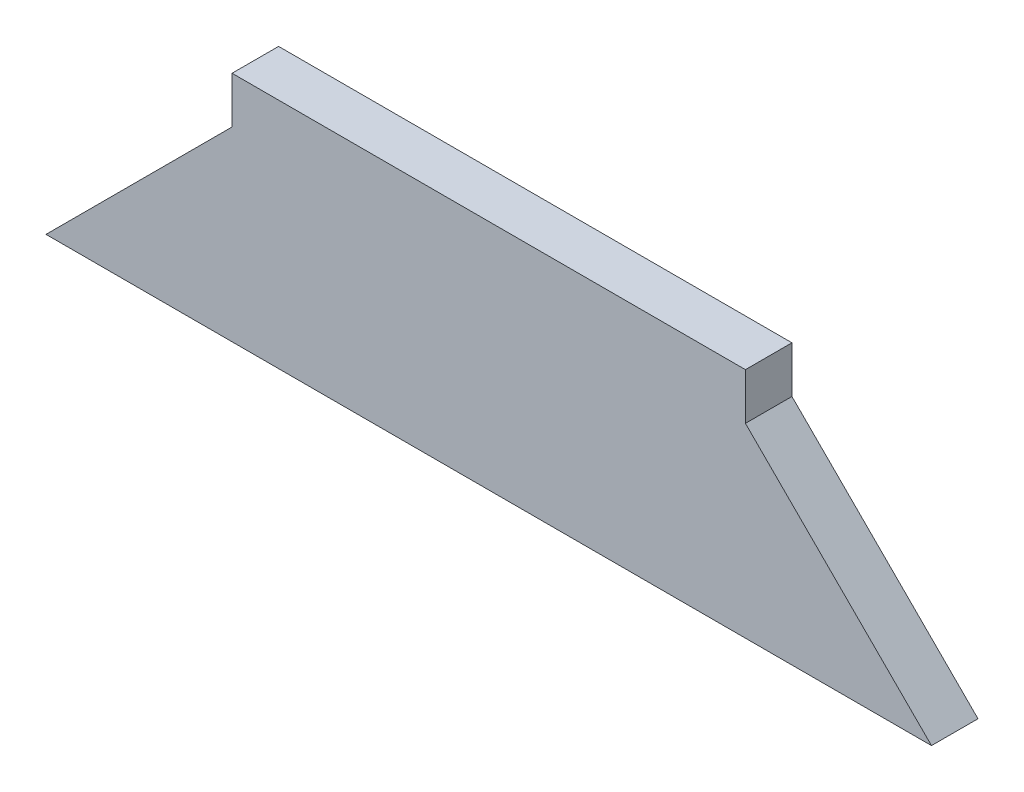
ISO-10303-21;
HEADER;
FILE_DESCRIPTION(('STEP AP214'),'2;1');
FILE_NAME('part.step','',(''),(''),'','','');
FILE_SCHEMA(('AUTOMOTIVE_DESIGN { 1 0 10303 214 1 1 1 1 }'));
ENDSEC;
DATA;
#1=APPLICATION_CONTEXT('core data for automotive mechanical design processes');
#2=APPLICATION_PROTOCOL_DEFINITION('international standard','automotive_design',2000,#1);
#3=PRODUCT_CONTEXT('',#1,'mechanical');
#4=PRODUCT('Part','Part','',(#3));
#5=PRODUCT_RELATED_PRODUCT_CATEGORY('part','',(#4));
#6=PRODUCT_DEFINITION_FORMATION('','',#4);
#7=PRODUCT_DEFINITION_CONTEXT('part definition',#1,'design');
#8=PRODUCT_DEFINITION('design','',#6,#7);
#9=PRODUCT_DEFINITION_SHAPE('','',#8);
#10=(LENGTH_UNIT() NAMED_UNIT(*) SI_UNIT(.MILLI.,.METRE.));
#11=(NAMED_UNIT(*) PLANE_ANGLE_UNIT() SI_UNIT($,.RADIAN.));
#12=(NAMED_UNIT(*) SI_UNIT($,.STERADIAN.) SOLID_ANGLE_UNIT());
#13=UNCERTAINTY_MEASURE_WITH_UNIT(LENGTH_MEASURE(1.E-05),#10,'distance_accuracy_value','');
#14=(GEOMETRIC_REPRESENTATION_CONTEXT(3) GLOBAL_UNCERTAINTY_ASSIGNED_CONTEXT((#13)) GLOBAL_UNIT_ASSIGNED_CONTEXT((#10,
#11,#12)) REPRESENTATION_CONTEXT('',''));
#15=CARTESIAN_POINT('',(0.,0.,0.));
#16=DIRECTION('',(0.,0.,1.));
#17=DIRECTION('',(1.,0.,0.));
#18=AXIS2_PLACEMENT_3D('',#15,#16,#17);
#19=CARTESIAN_POINT('',(16.5550000000012,7.00000000000001,3.));
#20=DIRECTION('',(-1.,0.,0.));
#21=DIRECTION('',(0.,-1.,0.));
#22=AXIS2_PLACEMENT_3D('',#19,#20,#21);
#23=PLANE('',#22);
#24=DIRECTION('',(0.,1.,0.));
#25=VECTOR('',#24,1.);
#26=CARTESIAN_POINT('',(16.5550000000012,7.00000000000001,0.));
#27=LINE('',#26,#25);
#28=CARTESIAN_POINT('',(16.5550000000012,7.00000000000001,0.));
#29=VERTEX_POINT('',#28);
#30=CARTESIAN_POINT('',(16.5550000000012,10.,0.));
#31=VERTEX_POINT('',#30);
#32=EDGE_CURVE('E116',#29,#31,#27,.T.);
#33=ORIENTED_EDGE('',*,*,#32,.T.);
#34=DIRECTION('',(0.,0.,-1.));
#35=VECTOR('',#34,1.);
#36=CARTESIAN_POINT('',(16.5550000000012,10.,3.));
#37=LINE('',#36,#35);
#38=CARTESIAN_POINT('',(16.5550000000012,10.,3.));
#39=VERTEX_POINT('',#38);
#40=EDGE_CURVE('E11',#39,#31,#37,.T.);
#41=ORIENTED_EDGE('',*,*,#40,.F.);
#42=DIRECTION('',(0.,1.,0.));
#43=VECTOR('',#42,1.);
#44=CARTESIAN_POINT('',(16.5550000000012,7.00000000000001,3.));
#45=LINE('',#44,#43);
#46=CARTESIAN_POINT('',(16.5550000000012,7.00000000000001,3.));
#47=VERTEX_POINT('',#46);
#48=EDGE_CURVE('E126',#47,#39,#45,.T.);
#49=ORIENTED_EDGE('',*,*,#48,.F.);
#50=DIRECTION('',(0.,0.,-1.));
#51=VECTOR('',#50,1.);
#52=CARTESIAN_POINT('',(16.5550000000012,7.00000000000001,3.));
#53=LINE('',#52,#51);
#54=EDGE_CURVE('E112',#47,#29,#53,.T.);
#55=ORIENTED_EDGE('',*,*,#54,.T.);
#56=EDGE_LOOP('',(#33,#41,#49,#55));
#57=FACE_BOUND('',#56,.T.);
#58=ADVANCED_FACE('F32',(#57),#23,.F.);
#59=CARTESIAN_POINT('',(-16.5549999999988,10.,3.));
#60=DIRECTION('',(0.,-1.,0.));
#61=DIRECTION('',(0.,0.,-1.));
#62=AXIS2_PLACEMENT_3D('',#59,#60,#61);
#63=PLANE('',#62);
#64=DIRECTION('',(-1.,0.,0.));
#65=VECTOR('',#64,1.);
#66=CARTESIAN_POINT('',(-16.5549999999988,10.,0.));
#67=LINE('',#66,#65);
#68=CARTESIAN_POINT('',(-16.5549999999988,10.,0.));
#69=VERTEX_POINT('',#68);
#70=EDGE_CURVE('E119',#31,#69,#67,.T.);
#71=ORIENTED_EDGE('',*,*,#70,.T.);
#72=DIRECTION('',(0.,0.,-1.));
#73=VECTOR('',#72,1.);
#74=CARTESIAN_POINT('',(-16.5549999999988,10.,3.));
#75=LINE('',#74,#73);
#76=CARTESIAN_POINT('',(-16.5549999999988,10.,3.));
#77=VERTEX_POINT('',#76);
#78=EDGE_CURVE('E40',#77,#69,#75,.T.);
#79=ORIENTED_EDGE('',*,*,#78,.F.);
#80=DIRECTION('',(-1.,0.,0.));
#81=VECTOR('',#80,1.);
#82=CARTESIAN_POINT('',(-16.5549999999988,10.,3.));
#83=LINE('',#82,#81);
#84=EDGE_CURVE('E85',#39,#77,#83,.T.);
#85=ORIENTED_EDGE('',*,*,#84,.F.);
#86=ORIENTED_EDGE('',*,*,#40,.T.);
#87=EDGE_LOOP('',(#71,#79,#85,#86));
#88=FACE_BOUND('',#87,.T.);
#89=ADVANCED_FACE('F150',(#88),#63,.F.);
#90=CARTESIAN_POINT('',(-16.5549999999988,7.00000000000117,3.));
#91=DIRECTION('',(1.,0.,0.));
#92=DIRECTION('',(0.,0.,-1.));
#93=AXIS2_PLACEMENT_3D('',#90,#91,#92);
#94=PLANE('',#93);
#95=DIRECTION('',(0.,-1.,0.));
#96=VECTOR('',#95,1.);
#97=CARTESIAN_POINT('',(-16.5549999999988,7.00000000000117,0.));
#98=LINE('',#97,#96);
#99=CARTESIAN_POINT('',(-16.5549999999988,7.00000000000117,0.));
#100=VERTEX_POINT('',#99);
#101=EDGE_CURVE('E121',#69,#100,#98,.T.);
#102=ORIENTED_EDGE('',*,*,#101,.T.);
#103=DIRECTION('',(0.,0.,-1.));
#104=VECTOR('',#103,1.);
#105=CARTESIAN_POINT('',(-16.5549999999988,7.00000000000117,3.));
#106=LINE('',#105,#104);
#107=CARTESIAN_POINT('',(-16.5549999999988,7.00000000000117,3.));
#108=VERTEX_POINT('',#107);
#109=EDGE_CURVE('E107',#108,#100,#106,.T.);
#110=ORIENTED_EDGE('',*,*,#109,.F.);
#111=DIRECTION('',(0.,-1.,0.));
#112=VECTOR('',#111,1.);
#113=CARTESIAN_POINT('',(-16.5549999999988,7.00000000000117,3.));
#114=LINE('',#113,#112);
#115=EDGE_CURVE('E98',#77,#108,#114,.T.);
#116=ORIENTED_EDGE('',*,*,#115,.F.);
#117=ORIENTED_EDGE('',*,*,#78,.T.);
#118=EDGE_LOOP('',(#102,#110,#116,#117));
#119=FACE_BOUND('',#118,.T.);
#120=ADVANCED_FACE('F132',(#119),#94,.F.);
#121=CARTESIAN_POINT('',(-16.5549999999988,7.00000000000117,3.));
#122=DIRECTION('',(0.707106781186547,-0.707106781186547,0.));
#123=DIRECTION('',(0.707106781186548,0.707106781186548,0.));
#124=AXIS2_PLACEMENT_3D('',#121,#122,#123);
#125=PLANE('',#124);
#126=DIRECTION('',(-0.707106781186548,-0.707106781186548,0.));
#127=VECTOR('',#126,1.);
#128=CARTESIAN_POINT('',(-16.5549999999988,7.00000000000117,0.));
#129=LINE('',#128,#127);
#130=CARTESIAN_POINT('',(-28.555,-4.99999999999999,0.));
#131=VERTEX_POINT('',#130);
#132=EDGE_CURVE('E106',#100,#131,#129,.T.);
#133=ORIENTED_EDGE('',*,*,#132,.T.);
#134=DIRECTION('',(0.,0.,-1.));
#135=VECTOR('',#134,1.);
#136=CARTESIAN_POINT('',(-28.555,-4.99999999999999,3.));
#137=LINE('',#136,#135);
#138=CARTESIAN_POINT('',(-28.555,-4.99999999999999,3.));
#139=VERTEX_POINT('',#138);
#140=EDGE_CURVE('E103',#139,#131,#137,.T.);
#141=ORIENTED_EDGE('',*,*,#140,.F.);
#142=DIRECTION('',(-0.707106781186548,-0.707106781186548,0.));
#143=VECTOR('',#142,1.);
#144=CARTESIAN_POINT('',(-16.5549999999988,7.00000000000117,3.));
#145=LINE('',#144,#143);
#146=EDGE_CURVE('E92',#108,#139,#145,.T.);
#147=ORIENTED_EDGE('',*,*,#146,.F.);
#148=ORIENTED_EDGE('',*,*,#109,.T.);
#149=EDGE_LOOP('',(#133,#141,#147,#148));
#150=FACE_BOUND('',#149,.T.);
#151=ADVANCED_FACE('F104',(#150),#125,.F.);
#152=CARTESIAN_POINT('',(-28.555,-4.99999999999999,3.));
#153=DIRECTION('',(0.,1.,0.));
#154=DIRECTION('',(0.,0.,1.));
#155=AXIS2_PLACEMENT_3D('',#152,#153,#154);
#156=PLANE('',#155);
#157=DIRECTION('',(1.,0.,0.));
#158=VECTOR('',#157,1.);
#159=CARTESIAN_POINT('',(-28.555,-4.99999999999999,0.));
#160=LINE('',#159,#158);
#161=CARTESIAN_POINT('',(28.5550000000012,-4.99999999999999,0.));
#162=VERTEX_POINT('',#161);
#163=EDGE_CURVE('E71',#131,#162,#160,.T.);
#164=ORIENTED_EDGE('',*,*,#163,.T.);
#165=DIRECTION('',(0.,0.,-1.));
#166=VECTOR('',#165,1.);
#167=CARTESIAN_POINT('',(28.5550000000012,-4.99999999999999,3.));
#168=LINE('',#167,#166);
#169=CARTESIAN_POINT('',(28.5550000000012,-4.99999999999999,3.));
#170=VERTEX_POINT('',#169);
#171=EDGE_CURVE('E108',#170,#162,#168,.T.);
#172=ORIENTED_EDGE('',*,*,#171,.F.);
#173=DIRECTION('',(1.,0.,0.));
#174=VECTOR('',#173,1.);
#175=CARTESIAN_POINT('',(-28.555,-4.99999999999999,3.));
#176=LINE('',#175,#174);
#177=EDGE_CURVE('E96',#139,#170,#176,.T.);
#178=ORIENTED_EDGE('',*,*,#177,.F.);
#179=ORIENTED_EDGE('',*,*,#140,.T.);
#180=EDGE_LOOP('',(#164,#172,#178,#179));
#181=FACE_BOUND('',#180,.T.);
#182=ADVANCED_FACE('F110',(#181),#156,.F.);
#183=CARTESIAN_POINT('',(28.5550000000012,-4.99999999999999,3.));
#184=DIRECTION('',(-0.707106781186547,-0.707106781186548,0.));
#185=DIRECTION('',(0.707106781186548,-0.707106781186547,0.));
#186=AXIS2_PLACEMENT_3D('',#183,#184,#185);
#187=PLANE('',#186);
#188=DIRECTION('',(-0.707106781186548,0.707106781186547,0.));
#189=VECTOR('',#188,1.);
#190=CARTESIAN_POINT('',(28.5550000000012,-4.99999999999999,0.));
#191=LINE('',#190,#189);
#192=EDGE_CURVE('E77',#162,#29,#191,.T.);
#193=ORIENTED_EDGE('',*,*,#192,.T.);
#194=ORIENTED_EDGE('',*,*,#54,.F.);
#195=DIRECTION('',(-0.707106781186548,0.707106781186547,0.));
#196=VECTOR('',#195,1.);
#197=CARTESIAN_POINT('',(28.5550000000012,-4.99999999999999,3.));
#198=LINE('',#197,#196);
#199=EDGE_CURVE('E48',#170,#47,#198,.T.);
#200=ORIENTED_EDGE('',*,*,#199,.F.);
#201=ORIENTED_EDGE('',*,*,#171,.T.);
#202=EDGE_LOOP('',(#193,#194,#200,#201));
#203=FACE_BOUND('',#202,.T.);
#204=ADVANCED_FACE('F139',(#203),#187,.F.);
#205=CARTESIAN_POINT('',(0.,0.,3.));
#206=DIRECTION('',(0.,0.,-1.));
#207=DIRECTION('',(-1.,0.,0.));
#208=AXIS2_PLACEMENT_3D('',#205,#206,#207);
#209=PLANE('',#208);
#210=ORIENTED_EDGE('',*,*,#48,.T.);
#211=ORIENTED_EDGE('',*,*,#84,.T.);
#212=ORIENTED_EDGE('',*,*,#115,.T.);
#213=ORIENTED_EDGE('',*,*,#146,.T.);
#214=ORIENTED_EDGE('',*,*,#177,.T.);
#215=ORIENTED_EDGE('',*,*,#199,.T.);
#216=EDGE_LOOP('',(#210,#211,#212,#213,#214,#215));
#217=FACE_BOUND('',#216,.T.);
#218=ADVANCED_FACE('F94',(#217),#209,.F.);
#219=CARTESIAN_POINT('',(0.,0.,0.));
#220=DIRECTION('',(0.,0.,-1.));
#221=DIRECTION('',(-1.,0.,0.));
#222=AXIS2_PLACEMENT_3D('',#219,#220,#221);
#223=PLANE('',#222);
#224=ORIENTED_EDGE('',*,*,#32,.F.);
#225=ORIENTED_EDGE('',*,*,#192,.F.);
#226=ORIENTED_EDGE('',*,*,#163,.F.);
#227=ORIENTED_EDGE('',*,*,#132,.F.);
#228=ORIENTED_EDGE('',*,*,#101,.F.);
#229=ORIENTED_EDGE('',*,*,#70,.F.);
#230=EDGE_LOOP('',(#224,#225,#226,#227,#228,#229));
#231=FACE_BOUND('',#230,.T.);
#232=ADVANCED_FACE('F135',(#231),#223,.T.);
#233=CLOSED_SHELL('',(#58,#89,#120,#151,#182,#204,#218,#232));
#234=MANIFOLD_SOLID_BREP('B2',#233);
#235=ADVANCED_BREP_SHAPE_REPRESENTATION('',(#18,#234),#14);
#236=SHAPE_DEFINITION_REPRESENTATION(#9,#235);
ENDSEC;
END-ISO-10303-21;
